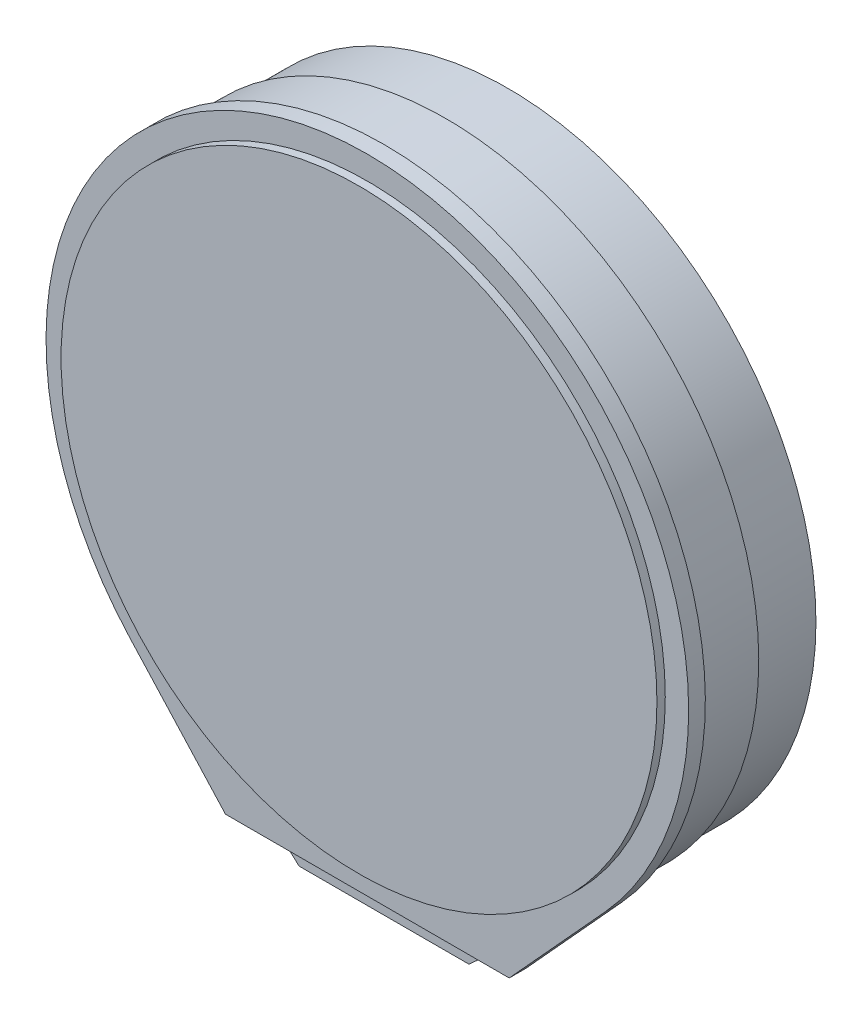
ISO-10303-21;
HEADER;
FILE_DESCRIPTION(('STEP AP214'),'2;1');
FILE_NAME('part.step','',(''),(''),'','','');
FILE_SCHEMA(('AUTOMOTIVE_DESIGN { 1 0 10303 214 1 1 1 1 }'));
ENDSEC;
DATA;
#1=APPLICATION_CONTEXT('core data for automotive mechanical design processes');
#2=APPLICATION_PROTOCOL_DEFINITION('international standard','automotive_design',2000,#1);
#3=PRODUCT_CONTEXT('',#1,'mechanical');
#4=PRODUCT('Part','Part','',(#3));
#5=PRODUCT_RELATED_PRODUCT_CATEGORY('part','',(#4));
#6=PRODUCT_DEFINITION_FORMATION('','',#4);
#7=PRODUCT_DEFINITION_CONTEXT('part definition',#1,'design');
#8=PRODUCT_DEFINITION('design','',#6,#7);
#9=PRODUCT_DEFINITION_SHAPE('','',#8);
#10=(LENGTH_UNIT() NAMED_UNIT(*) SI_UNIT(.MILLI.,.METRE.));
#11=(NAMED_UNIT(*) PLANE_ANGLE_UNIT() SI_UNIT($,.RADIAN.));
#12=(NAMED_UNIT(*) SI_UNIT($,.STERADIAN.) SOLID_ANGLE_UNIT());
#13=UNCERTAINTY_MEASURE_WITH_UNIT(LENGTH_MEASURE(1.E-05),#10,'distance_accuracy_value','');
#14=(GEOMETRIC_REPRESENTATION_CONTEXT(3) GLOBAL_UNCERTAINTY_ASSIGNED_CONTEXT((#13)) GLOBAL_UNIT_ASSIGNED_CONTEXT((#10,
#11,#12)) REPRESENTATION_CONTEXT('',''));
#15=CARTESIAN_POINT('',(0.,0.,0.));
#16=DIRECTION('',(0.,0.,1.));
#17=DIRECTION('',(1.,0.,0.));
#18=AXIS2_PLACEMENT_3D('',#15,#16,#17);
#19=CARTESIAN_POINT('',(0.,0.,0.));
#20=DIRECTION('',(0.,0.,-1.));
#21=DIRECTION('',(-1.,0.,0.));
#22=AXIS2_PLACEMENT_3D('',#19,#20,#21);
#23=PLANE('',#22);
#24=DIRECTION('',(1.,0.,0.));
#25=VECTOR('',#24,1.);
#26=CARTESIAN_POINT('',(-8.49999999999999,-19.25,0.));
#27=LINE('',#26,#25);
#28=CARTESIAN_POINT('',(-6.72235531572185,-19.25,0.));
#29=VERTEX_POINT('',#28);
#30=CARTESIAN_POINT('',(6.72235531572185,-19.25,0.));
#31=VERTEX_POINT('',#30);
#32=EDGE_CURVE('E215',#29,#31,#27,.T.);
#33=ORIENTED_EDGE('',*,*,#32,.F.);
#34=DIRECTION('',(0.7386096728915,-0.674133333333333,0.));
#35=VECTOR('',#34,1.);
#36=CARTESIAN_POINT('',(-12.64,-13.8489313667156,0.));
#37=LINE('',#36,#35);
#38=CARTESIAN_POINT('',(-5.08984679227198,-20.74,0.));
#39=VERTEX_POINT('',#38);
#40=EDGE_CURVE('E257',#29,#39,#37,.T.);
#41=ORIENTED_EDGE('',*,*,#40,.T.);
#42=DIRECTION('',(1.,0.,0.));
#43=VECTOR('',#42,1.);
#44=CARTESIAN_POINT('',(-5.08984679227198,-20.74,0.));
#45=LINE('',#44,#43);
#46=CARTESIAN_POINT('',(5.08984679227198,-20.74,0.));
#47=VERTEX_POINT('',#46);
#48=EDGE_CURVE('E262',#39,#47,#45,.T.);
#49=ORIENTED_EDGE('',*,*,#48,.T.);
#50=DIRECTION('',(0.7386096728915,0.674133333333333,0.));
#51=VECTOR('',#50,1.);
#52=CARTESIAN_POINT('',(5.08984679227198,-20.74,0.));
#53=LINE('',#52,#51);
#54=EDGE_CURVE('E248',#47,#31,#53,.T.);
#55=ORIENTED_EDGE('',*,*,#54,.T.);
#56=EDGE_LOOP('',(#33,#41,#49,#55));
#57=FACE_BOUND('',#56,.T.);
#58=ADVANCED_FACE('F39',(#57),#23,.F.);
#59=CARTESIAN_POINT('',(0.,0.,-3.7));
#60=DIRECTION('',(0.,0.,1.));
#61=DIRECTION('',(1.,0.,0.));
#62=AXIS2_PLACEMENT_3D('',#59,#60,#61);
#63=CYLINDRICAL_SURFACE('',#62,18.75);
#64=CARTESIAN_POINT('',(0.,0.,0.));
#65=DIRECTION('',(0.,0.,1.));
#66=DIRECTION('',(-1.,0.,0.));
#67=AXIS2_PLACEMENT_3D('',#64,#65,#66);
#68=CIRCLE('',#67,18.75);
#69=CARTESIAN_POINT('',(12.64,-13.8489313667156,0.));
#70=VERTEX_POINT('',#69);
#71=CARTESIAN_POINT('',(-12.64,-13.8489313667156,0.));
#72=VERTEX_POINT('',#71);
#73=EDGE_CURVE('E241',#70,#72,#68,.T.);
#74=ORIENTED_EDGE('',*,*,#73,.F.);
#75=DIRECTION('',(0.,0.,1.));
#76=VECTOR('',#75,1.);
#77=CARTESIAN_POINT('',(12.64,-13.8489313667156,-3.7));
#78=LINE('',#77,#76);
#79=CARTESIAN_POINT('',(12.64,-13.8489313667156,-3.7));
#80=VERTEX_POINT('',#79);
#81=EDGE_CURVE('E267',#80,#70,#78,.T.);
#82=ORIENTED_EDGE('',*,*,#81,.F.);
#83=CARTESIAN_POINT('',(0.,0.,-3.7));
#84=DIRECTION('',(0.,0.,1.));
#85=DIRECTION('',(-1.,0.,0.));
#86=AXIS2_PLACEMENT_3D('',#83,#84,#85);
#87=CIRCLE('',#86,18.75);
#88=CARTESIAN_POINT('',(-12.64,-13.8489313667156,-3.7));
#89=VERTEX_POINT('',#88);
#90=EDGE_CURVE('E243',#80,#89,#87,.T.);
#91=ORIENTED_EDGE('',*,*,#90,.T.);
#92=DIRECTION('',(0.,0.,1.));
#93=VECTOR('',#92,1.);
#94=CARTESIAN_POINT('',(-12.64,-13.8489313667156,-3.7));
#95=LINE('',#94,#93);
#96=EDGE_CURVE('E260',#89,#72,#95,.T.);
#97=ORIENTED_EDGE('',*,*,#96,.T.);
#98=EDGE_LOOP('',(#74,#82,#91,#97));
#99=FACE_BOUND('',#98,.T.);
#100=ADVANCED_FACE('F41',(#99),#63,.T.);
#101=CARTESIAN_POINT('',(5.08984679227198,-20.74,-3.7));
#102=DIRECTION('',(0.674133333333333,-0.7386096728915,0.));
#103=DIRECTION('',(0.7386096728915,0.674133333333333,0.));
#104=AXIS2_PLACEMENT_3D('',#101,#102,#103);
#105=PLANE('',#104);
#106=ORIENTED_EDGE('',*,*,#54,.F.);
#107=DIRECTION('',(0.,0.,1.));
#108=VECTOR('',#107,1.);
#109=CARTESIAN_POINT('',(5.08984679227198,-20.74,-3.7));
#110=LINE('',#109,#108);
#111=CARTESIAN_POINT('',(5.08984679227198,-20.74,-3.7));
#112=VERTEX_POINT('',#111);
#113=EDGE_CURVE('E271',#112,#47,#110,.T.);
#114=ORIENTED_EDGE('',*,*,#113,.F.);
#115=DIRECTION('',(0.7386096728915,0.674133333333333,0.));
#116=VECTOR('',#115,1.);
#117=CARTESIAN_POINT('',(5.08984679227198,-20.74,-3.7));
#118=LINE('',#117,#116);
#119=EDGE_CURVE('E255',#112,#80,#118,.T.);
#120=ORIENTED_EDGE('',*,*,#119,.T.);
#121=ORIENTED_EDGE('',*,*,#81,.T.);
#122=EDGE_CURVE('E270',#31,#70,#53,.T.);
#123=ORIENTED_EDGE('',*,*,#122,.F.);
#124=EDGE_LOOP('',(#106,#114,#120,#121,#123));
#125=FACE_BOUND('',#124,.T.);
#126=ADVANCED_FACE('F291',(#125),#105,.T.);
#127=CARTESIAN_POINT('',(-5.08984679227198,-20.74,-3.7));
#128=DIRECTION('',(0.,-1.,0.));
#129=DIRECTION('',(0.,0.,-1.));
#130=AXIS2_PLACEMENT_3D('',#127,#128,#129);
#131=PLANE('',#130);
#132=ORIENTED_EDGE('',*,*,#48,.F.);
#133=DIRECTION('',(0.,0.,1.));
#134=VECTOR('',#133,1.);
#135=CARTESIAN_POINT('',(-5.08984679227198,-20.74,-3.7));
#136=LINE('',#135,#134);
#137=CARTESIAN_POINT('',(-5.08984679227198,-20.74,-3.7));
#138=VERTEX_POINT('',#137);
#139=EDGE_CURVE('E272',#138,#39,#136,.T.);
#140=ORIENTED_EDGE('',*,*,#139,.F.);
#141=DIRECTION('',(1.,0.,0.));
#142=VECTOR('',#141,1.);
#143=CARTESIAN_POINT('',(-5.08984679227198,-20.74,-3.7));
#144=LINE('',#143,#142);
#145=CARTESIAN_POINT('',(-2.9,-20.74,-3.7));
#146=VERTEX_POINT('',#145);
#147=EDGE_CURVE('E252',#138,#146,#144,.T.);
#148=ORIENTED_EDGE('',*,*,#147,.T.);
#149=CARTESIAN_POINT('',(2.9,-20.74,-3.7));
#150=VERTEX_POINT('',#149);
#151=EDGE_CURVE('E177',#146,#150,#144,.T.);
#152=ORIENTED_EDGE('',*,*,#151,.T.);
#153=EDGE_CURVE('E53',#150,#112,#144,.T.);
#154=ORIENTED_EDGE('',*,*,#153,.T.);
#155=ORIENTED_EDGE('',*,*,#113,.T.);
#156=EDGE_LOOP('',(#132,#140,#148,#152,#154,#155));
#157=FACE_BOUND('',#156,.T.);
#158=ADVANCED_FACE('F300',(#157),#131,.T.);
#159=CARTESIAN_POINT('',(-12.64,-13.8489313667156,-3.7));
#160=DIRECTION('',(-0.674133333333333,-0.7386096728915,0.));
#161=DIRECTION('',(0.7386096728915,-0.674133333333333,0.));
#162=AXIS2_PLACEMENT_3D('',#159,#160,#161);
#163=PLANE('',#162);
#164=EDGE_CURVE('E261',#72,#29,#37,.T.);
#165=ORIENTED_EDGE('',*,*,#164,.F.);
#166=ORIENTED_EDGE('',*,*,#96,.F.);
#167=DIRECTION('',(0.7386096728915,-0.674133333333333,0.));
#168=VECTOR('',#167,1.);
#169=CARTESIAN_POINT('',(-12.64,-13.8489313667156,-3.7));
#170=LINE('',#169,#168);
#171=EDGE_CURVE('E247',#89,#138,#170,.T.);
#172=ORIENTED_EDGE('',*,*,#171,.T.);
#173=ORIENTED_EDGE('',*,*,#139,.T.);
#174=ORIENTED_EDGE('',*,*,#40,.F.);
#175=EDGE_LOOP('',(#165,#166,#172,#173,#174));
#176=FACE_BOUND('',#175,.T.);
#177=ADVANCED_FACE('F285',(#176),#163,.T.);
#178=CARTESIAN_POINT('',(0.,0.,-3.7));
#179=DIRECTION('',(0.,0.,-1.));
#180=DIRECTION('',(-1.,0.,0.));
#181=AXIS2_PLACEMENT_3D('',#178,#179,#180);
#182=PLANE('',#181);
#183=DIRECTION('',(0.,-1.,0.));
#184=VECTOR('',#183,1.);
#185=CARTESIAN_POINT('',(2.9,19.252,-3.7));
#186=LINE('',#185,#184);
#187=CARTESIAN_POINT('',(2.9,-18.2476169879188,-3.7));
#188=VERTEX_POINT('',#187);
#189=EDGE_CURVE('E175',#188,#150,#186,.T.);
#190=ORIENTED_EDGE('',*,*,#189,.F.);
#191=CARTESIAN_POINT('',(0.,0.,-3.7));
#192=DIRECTION('',(0.,0.,-1.));
#193=DIRECTION('',(-1.,0.,0.));
#194=AXIS2_PLACEMENT_3D('',#191,#192,#193);
#195=CIRCLE('',#194,18.4766210584561);
#196=CARTESIAN_POINT('',(-2.9,-18.2476169879188,-3.7));
#197=VERTEX_POINT('',#196);
#198=EDGE_CURVE('E11',#197,#188,#195,.T.);
#199=ORIENTED_EDGE('',*,*,#198,.F.);
#200=DIRECTION('',(0.,-1.,0.));
#201=VECTOR('',#200,1.);
#202=CARTESIAN_POINT('',(-2.9,19.252,-3.7));
#203=LINE('',#202,#201);
#204=EDGE_CURVE('E62',#197,#146,#203,.T.);
#205=ORIENTED_EDGE('',*,*,#204,.T.);
#206=ORIENTED_EDGE('',*,*,#147,.F.);
#207=ORIENTED_EDGE('',*,*,#171,.F.);
#208=ORIENTED_EDGE('',*,*,#90,.F.);
#209=ORIENTED_EDGE('',*,*,#119,.F.);
#210=ORIENTED_EDGE('',*,*,#153,.F.);
#211=EDGE_LOOP('',(#190,#199,#205,#206,#207,#208,#209,#210));
#212=FACE_BOUND('',#211,.T.);
#213=ADVANCED_FACE('F293',(#212),#182,.T.);
#214=CARTESIAN_POINT('',(0.,0.,0.));
#215=DIRECTION('',(0.,0.,1.));
#216=DIRECTION('',(1.,0.,0.));
#217=AXIS2_PLACEMENT_3D('',#214,#215,#216);
#218=PLANE('',#217);
#219=ORIENTED_EDGE('',*,*,#73,.T.);
#220=ORIENTED_EDGE('',*,*,#164,.T.);
#221=CARTESIAN_POINT('',(-8.49999999999999,-19.25,0.));
#222=VERTEX_POINT('',#221);
#223=EDGE_CURVE('E226',#222,#29,#27,.T.);
#224=ORIENTED_EDGE('',*,*,#223,.F.);
#225=DIRECTION('',(0.673676781933663,-0.739026111503175,0.));
#226=VECTOR('',#225,1.);
#227=CARTESIAN_POINT('',(-14.2262526464361,-12.968278052223,0.));
#228=LINE('',#227,#226);
#229=CARTESIAN_POINT('',(-14.2262526464361,-12.968278052223,0.));
#230=VERTEX_POINT('',#229);
#231=EDGE_CURVE('E227',#230,#222,#228,.T.);
#232=ORIENTED_EDGE('',*,*,#231,.F.);
#233=CARTESIAN_POINT('',(0.,0.,0.));
#234=DIRECTION('',(0.,0.,1.));
#235=DIRECTION('',(1.,0.,0.));
#236=AXIS2_PLACEMENT_3D('',#233,#234,#235);
#237=CIRCLE('',#236,19.25);
#238=CARTESIAN_POINT('',(14.2262526464361,-12.968278052223,0.));
#239=VERTEX_POINT('',#238);
#240=EDGE_CURVE('E207',#239,#230,#237,.T.);
#241=ORIENTED_EDGE('',*,*,#240,.F.);
#242=DIRECTION('',(0.673676781933663,0.739026111503175,0.));
#243=VECTOR('',#242,1.);
#244=CARTESIAN_POINT('',(8.50000000000001,-19.25,0.));
#245=LINE('',#244,#243);
#246=CARTESIAN_POINT('',(8.50000000000001,-19.25,0.));
#247=VERTEX_POINT('',#246);
#248=EDGE_CURVE('E220',#247,#239,#245,.T.);
#249=ORIENTED_EDGE('',*,*,#248,.F.);
#250=EDGE_CURVE('E230',#31,#247,#27,.T.);
#251=ORIENTED_EDGE('',*,*,#250,.F.);
#252=ORIENTED_EDGE('',*,*,#122,.T.);
#253=EDGE_LOOP('',(#219,#220,#224,#232,#241,#249,#251,#252));
#254=FACE_BOUND('',#253,.T.);
#255=ADVANCED_FACE('F286',(#254),#218,.F.);
#256=CARTESIAN_POINT('',(0.,0.,1.));
#257=DIRECTION('',(0.,0.,-1.));
#258=DIRECTION('',(-1.,0.,0.));
#259=AXIS2_PLACEMENT_3D('',#256,#257,#258);
#260=CYLINDRICAL_SURFACE('',#259,19.25);
#261=ORIENTED_EDGE('',*,*,#240,.T.);
#262=DIRECTION('',(0.,0.,-1.));
#263=VECTOR('',#262,1.);
#264=CARTESIAN_POINT('',(-14.2262526464361,-12.968278052223,1.));
#265=LINE('',#264,#263);
#266=CARTESIAN_POINT('',(-14.2262526464361,-12.968278052223,1.));
#267=VERTEX_POINT('',#266);
#268=EDGE_CURVE('E242',#267,#230,#265,.T.);
#269=ORIENTED_EDGE('',*,*,#268,.F.);
#270=CARTESIAN_POINT('',(0.,0.,1.));
#271=DIRECTION('',(0.,0.,1.));
#272=DIRECTION('',(1.,0.,0.));
#273=AXIS2_PLACEMENT_3D('',#270,#271,#272);
#274=CIRCLE('',#273,19.25);
#275=CARTESIAN_POINT('',(14.2262526464361,-12.968278052223,1.));
#276=VERTEX_POINT('',#275);
#277=EDGE_CURVE('E213',#276,#267,#274,.T.);
#278=ORIENTED_EDGE('',*,*,#277,.F.);
#279=DIRECTION('',(0.,0.,-1.));
#280=VECTOR('',#279,1.);
#281=CARTESIAN_POINT('',(14.2262526464361,-12.968278052223,1.));
#282=LINE('',#281,#280);
#283=EDGE_CURVE('E224',#276,#239,#282,.T.);
#284=ORIENTED_EDGE('',*,*,#283,.T.);
#285=EDGE_LOOP('',(#261,#269,#278,#284));
#286=FACE_BOUND('',#285,.T.);
#287=ADVANCED_FACE('F313',(#286),#260,.T.);
#288=CARTESIAN_POINT('',(-14.2262526464361,-12.968278052223,1.));
#289=DIRECTION('',(0.739026111503176,0.673676781933663,0.));
#290=DIRECTION('',(-0.673676781933663,0.739026111503176,0.));
#291=AXIS2_PLACEMENT_3D('',#288,#289,#290);
#292=PLANE('',#291);
#293=ORIENTED_EDGE('',*,*,#231,.T.);
#294=DIRECTION('',(0.,0.,-1.));
#295=VECTOR('',#294,1.);
#296=CARTESIAN_POINT('',(-8.49999999999999,-19.25,1.));
#297=LINE('',#296,#295);
#298=CARTESIAN_POINT('',(-8.49999999999999,-19.25,1.));
#299=VERTEX_POINT('',#298);
#300=EDGE_CURVE('E236',#299,#222,#297,.T.);
#301=ORIENTED_EDGE('',*,*,#300,.F.);
#302=DIRECTION('',(0.673676781933663,-0.739026111503175,0.));
#303=VECTOR('',#302,1.);
#304=CARTESIAN_POINT('',(-14.2262526464361,-12.968278052223,1.));
#305=LINE('',#304,#303);
#306=EDGE_CURVE('E216',#267,#299,#305,.T.);
#307=ORIENTED_EDGE('',*,*,#306,.F.);
#308=ORIENTED_EDGE('',*,*,#268,.T.);
#309=EDGE_LOOP('',(#293,#301,#307,#308));
#310=FACE_BOUND('',#309,.T.);
#311=ADVANCED_FACE('F320',(#310),#292,.F.);
#312=CARTESIAN_POINT('',(-8.49999999999999,-19.25,1.));
#313=DIRECTION('',(0.,1.,0.));
#314=DIRECTION('',(-1.,0.,0.));
#315=AXIS2_PLACEMENT_3D('',#312,#313,#314);
#316=PLANE('',#315);
#317=ORIENTED_EDGE('',*,*,#223,.T.);
#318=ORIENTED_EDGE('',*,*,#32,.T.);
#319=ORIENTED_EDGE('',*,*,#250,.T.);
#320=DIRECTION('',(0.,0.,-1.));
#321=VECTOR('',#320,1.);
#322=CARTESIAN_POINT('',(8.50000000000001,-19.25,1.));
#323=LINE('',#322,#321);
#324=CARTESIAN_POINT('',(8.50000000000001,-19.25,1.));
#325=VERTEX_POINT('',#324);
#326=EDGE_CURVE('E234',#325,#247,#323,.T.);
#327=ORIENTED_EDGE('',*,*,#326,.F.);
#328=DIRECTION('',(1.,0.,0.));
#329=VECTOR('',#328,1.);
#330=CARTESIAN_POINT('',(-8.49999999999999,-19.25,1.));
#331=LINE('',#330,#329);
#332=EDGE_CURVE('E218',#299,#325,#331,.T.);
#333=ORIENTED_EDGE('',*,*,#332,.F.);
#334=ORIENTED_EDGE('',*,*,#300,.T.);
#335=EDGE_LOOP('',(#317,#318,#319,#327,#333,#334));
#336=FACE_BOUND('',#335,.T.);
#337=ADVANCED_FACE('F305',(#336),#316,.F.);
#338=CARTESIAN_POINT('',(8.50000000000001,-19.25,1.));
#339=DIRECTION('',(-0.739026111503176,0.673676781933663,0.));
#340=DIRECTION('',(-0.673676781933663,-0.739026111503176,0.));
#341=AXIS2_PLACEMENT_3D('',#338,#339,#340);
#342=PLANE('',#341);
#343=ORIENTED_EDGE('',*,*,#248,.T.);
#344=ORIENTED_EDGE('',*,*,#283,.F.);
#345=DIRECTION('',(0.673676781933663,0.739026111503175,0.));
#346=VECTOR('',#345,1.);
#347=CARTESIAN_POINT('',(8.50000000000001,-19.25,1.));
#348=LINE('',#347,#346);
#349=EDGE_CURVE('E222',#325,#276,#348,.T.);
#350=ORIENTED_EDGE('',*,*,#349,.F.);
#351=ORIENTED_EDGE('',*,*,#326,.T.);
#352=EDGE_LOOP('',(#343,#344,#350,#351));
#353=FACE_BOUND('',#352,.T.);
#354=ADVANCED_FACE('F308',(#353),#342,.F.);
#355=CARTESIAN_POINT('',(0.,0.,1.));
#356=DIRECTION('',(0.,0.,1.));
#357=DIRECTION('',(1.,0.,0.));
#358=AXIS2_PLACEMENT_3D('',#355,#356,#357);
#359=PLANE('',#358);
#360=CARTESIAN_POINT('',(0.,0.,1.));
#361=DIRECTION('',(0.,0.,1.));
#362=DIRECTION('',(1.,0.,0.));
#363=AXIS2_PLACEMENT_3D('',#360,#361,#362);
#364=CIRCLE('',#363,17.85);
#365=CARTESIAN_POINT('',(17.85,0.,1.));
#366=VERTEX_POINT('',#365);
#367=EDGE_CURVE('E50',#366,#366,#364,.T.);
#368=ORIENTED_EDGE('',*,*,#367,.F.);
#369=EDGE_LOOP('',(#368));
#370=FACE_BOUND('',#369,.T.);
#371=ORIENTED_EDGE('',*,*,#277,.T.);
#372=ORIENTED_EDGE('',*,*,#306,.T.);
#373=ORIENTED_EDGE('',*,*,#332,.T.);
#374=ORIENTED_EDGE('',*,*,#349,.T.);
#375=EDGE_LOOP('',(#371,#372,#373,#374));
#376=FACE_BOUND('',#375,.T.);
#377=ADVANCED_FACE('F314',(#370,#376),#359,.T.);
#378=CARTESIAN_POINT('',(0.,0.,1.5));
#379=DIRECTION('',(0.,0.,-1.));
#380=DIRECTION('',(-1.,0.,0.));
#381=AXIS2_PLACEMENT_3D('',#378,#379,#380);
#382=CYLINDRICAL_SURFACE('',#381,17.85);
#383=CARTESIAN_POINT('',(0.,0.,1.5));
#384=DIRECTION('',(0.,0.,1.));
#385=DIRECTION('',(1.,0.,0.));
#386=AXIS2_PLACEMENT_3D('',#383,#384,#385);
#387=CIRCLE('',#386,17.85);
#388=CARTESIAN_POINT('',(17.85,0.,1.5));
#389=VERTEX_POINT('',#388);
#390=EDGE_CURVE('E206',#389,#389,#387,.T.);
#391=ORIENTED_EDGE('',*,*,#390,.F.);
#392=EDGE_LOOP('',(#391));
#393=FACE_BOUND('',#392,.T.);
#394=ORIENTED_EDGE('',*,*,#367,.T.);
#395=EDGE_LOOP('',(#394));
#396=FACE_BOUND('',#395,.T.);
#397=ADVANCED_FACE('F351',(#393,#396),#382,.T.);
#398=CARTESIAN_POINT('',(0.,0.,1.5));
#399=DIRECTION('',(0.,0.,1.));
#400=DIRECTION('',(1.,0.,0.));
#401=AXIS2_PLACEMENT_3D('',#398,#399,#400);
#402=PLANE('',#401);
#403=ORIENTED_EDGE('',*,*,#390,.T.);
#404=EDGE_LOOP('',(#403));
#405=FACE_BOUND('',#404,.T.);
#406=ADVANCED_FACE('F358',(#405),#402,.T.);
#407=CARTESIAN_POINT('',(0.,0.,-7.4));
#408=DIRECTION('',(0.,0.,1.));
#409=DIRECTION('',(1.,0.,0.));
#410=AXIS2_PLACEMENT_3D('',#407,#408,#409);
#411=CYLINDRICAL_SURFACE('',#410,18.4766210584561);
#412=CARTESIAN_POINT('',(2.9,-18.2476169879188,-3.7));
#413=CARTESIAN_POINT('',(2.94574135987661,-18.2403485397385,-3.70000050805307));
#414=CARTESIAN_POINT('',(2.99143210800008,-18.23290959918,-3.70196262020682));
#415=CARTESIAN_POINT('',(3.08242755504852,-18.2177465231141,-3.70977752768522));
#416=CARTESIAN_POINT('',(3.12773229049619,-18.2100224149651,-3.71562995069222));
#417=CARTESIAN_POINT('',(3.26251042489939,-18.1865288004241,-3.73894972430463));
#418=CARTESIAN_POINT('',(3.35099501160416,-18.17041453534,-3.76217980630119));
#419=CARTESIAN_POINT('',(3.52265925656955,-18.1379175657642,-3.82331086073215));
#420=CARTESIAN_POINT('',(3.60583766110316,-18.1215347989728,-3.86121528552661));
#421=CARTESIAN_POINT('',(3.76461493936751,-18.0892168010979,-3.9506529688397));
#422=CARTESIAN_POINT('',(3.84021457880043,-18.0732815249207,-4.00218484862375));
#423=CARTESIAN_POINT('',(3.98183069828908,-18.0426112468145,-4.11762706665945));
#424=CARTESIAN_POINT('',(4.04782781052399,-18.0278786962747,-4.18156183144911));
#425=CARTESIAN_POINT('',(4.16810245302212,-18.0004517237891,-4.32003854943417));
#426=CARTESIAN_POINT('',(4.22237950910234,-17.9877573843128,-4.39458093160192));
#427=CARTESIAN_POINT('',(4.31673115945308,-17.9653466850374,-4.55094789870452));
#428=CARTESIAN_POINT('',(4.35701640463492,-17.9555864830872,-4.63263896906447));
#429=CARTESIAN_POINT('',(4.4232219092382,-17.9393925267998,-4.80195140575219));
#430=CARTESIAN_POINT('',(4.44914552981681,-17.9329579941553,-4.88957137910371));
#431=CARTESIAN_POINT('',(4.4852364234967,-17.9239649381523,-5.06571492816385));
#432=CARTESIAN_POINT('',(4.49581033859622,-17.9213064240852,-5.15415018495788));
#433=CARTESIAN_POINT('',(4.50214876997347,-17.919715252995,-5.33158022021443));
#434=CARTESIAN_POINT('',(4.49791468996887,-17.9207822428142,-5.42057494484412));
#435=CARTESIAN_POINT('',(4.47497309031092,-17.9265243230581,-5.59509930712475));
#436=CARTESIAN_POINT('',(4.45649809855941,-17.9311414433984,-5.68066159797324));
#437=CARTESIAN_POINT('',(4.40596242011739,-17.9436254062684,-5.84742006417323));
#438=CARTESIAN_POINT('',(4.37390130061601,-17.951492352327,-5.92861610033685));
#439=CARTESIAN_POINT('',(4.29684339945518,-17.9700929312506,-6.08518215392118));
#440=CARTESIAN_POINT('',(4.25173166339273,-17.9808519763212,-6.16049249289004));
#441=CARTESIAN_POINT('',(4.15003563256678,-18.0045952108901,-6.3025176890538));
#442=CARTESIAN_POINT('',(4.09345043975032,-18.0175795745567,-6.36923187273961));
#443=CARTESIAN_POINT('',(3.96880501100291,-18.0454505555273,-6.49399706529904));
#444=CARTESIAN_POINT('',(3.90048829492797,-18.0603773326282,-6.55178285282338));
#445=CARTESIAN_POINT('',(3.75530349888284,-18.0911227047694,-6.65513809327409));
#446=CARTESIAN_POINT('',(3.67843158592713,-18.106941697971,-6.70070203901833));
#447=CARTESIAN_POINT('',(3.51645221080785,-18.1391029594718,-6.77928116973917));
#448=CARTESIAN_POINT('',(3.43120005728316,-18.1554490575632,-6.81199607803207));
#449=CARTESIAN_POINT('',(3.25635916708185,-18.1876198094878,-6.86245325251838));
#450=CARTESIAN_POINT('',(3.16677727281928,-18.2034452236736,-6.88021837574637));
#451=CARTESIAN_POINT('',(3.0470799568547,-18.22365834574,-6.89349943453923));
#452=CARTESIAN_POINT('',(3.01770646561756,-18.2285453832847,-6.89593745706605));
#453=CARTESIAN_POINT('',(2.958896450911,-18.2381835698962,-6.89918561101981));
#454=CARTESIAN_POINT('',(2.92946010695464,-18.2429349265141,-6.8999983764364));
#455=CARTESIAN_POINT('',(2.9,-18.2476169879188,-6.9));
#456=B_SPLINE_CURVE_WITH_KNOTS('',3,(#412,#413,#414,#415,#416,#417,#418,#419,#420,#421,#422,
#423,#424,#425,#426,#427,#428,#429,#430,#431,#432,#433,#434,#435,#436,#437,#438,#439,#440,#441,
#442,#443,#444,#445,#446,#447,#448,#449,#450,#451,#452,#453,#454,#455),.UNSPECIFIED.,.F.,.F.,(4,
2,2,2,2,2,2,2,2,2,2,2,2,2,2,2,2,2,2,2,2,4),(0.,0.138858371493959,0.277703455622433,
0.554951988025821,0.832265786997579,1.10955153994458,1.38738903407231,1.66523776715145,
1.93870090134817,2.21210000787957,2.47811507353407,2.74410492308587,3.00584132125186,
3.26758605813512,3.53171044420565,3.79585551186443,4.06675661894749,4.33777959023551,
4.61480510517371,4.8914062965676,4.98100493822506,5.07045825285307),.UNSPECIFIED.);
#457=CARTESIAN_POINT('',(2.9,-18.2476169879188,-6.9));
#458=VERTEX_POINT('',#457);
#459=EDGE_CURVE('E166',#188,#458,#456,.T.);
#460=ORIENTED_EDGE('',*,*,#459,.T.);
#461=CARTESIAN_POINT('',(0.,0.,-6.9));
#462=DIRECTION('',(0.,0.,-1.));
#463=DIRECTION('',(-1.,0.,0.));
#464=AXIS2_PLACEMENT_3D('',#461,#462,#463);
#465=CIRCLE('',#464,18.4766210584561);
#466=CARTESIAN_POINT('',(-2.9,-18.2476169879188,-6.9));
#467=VERTEX_POINT('',#466);
#468=EDGE_CURVE('E187',#458,#467,#465,.T.);
#469=ORIENTED_EDGE('',*,*,#468,.T.);
#470=CARTESIAN_POINT('',(-2.9,-18.2476169879188,-6.9));
#471=CARTESIAN_POINT('',(-2.94574135987661,-18.2403485397385,-6.89999949194693));
#472=CARTESIAN_POINT('',(-2.99143210800008,-18.23290959918,-6.89803737979318));
#473=CARTESIAN_POINT('',(-3.08242755504851,-18.2177465231141,-6.89022247231478));
#474=CARTESIAN_POINT('',(-3.12773229049619,-18.2100224149651,-6.88437004930778));
#475=CARTESIAN_POINT('',(-3.26251042489939,-18.1865288004241,-6.86105027569537));
#476=CARTESIAN_POINT('',(-3.35099501160416,-18.17041453534,-6.83782019369881));
#477=CARTESIAN_POINT('',(-3.52265925656955,-18.1379175657642,-6.77668913926785));
#478=CARTESIAN_POINT('',(-3.60583766110316,-18.1215347989728,-6.73878471447339));
#479=CARTESIAN_POINT('',(-3.76461493936751,-18.0892168010979,-6.6493470311603));
#480=CARTESIAN_POINT('',(-3.84021457880043,-18.0732815249207,-6.59781515137625));
#481=CARTESIAN_POINT('',(-3.98183069828908,-18.0426112468145,-6.48237293334055));
#482=CARTESIAN_POINT('',(-4.04782781052399,-18.0278786962747,-6.41843816855089));
#483=CARTESIAN_POINT('',(-4.16810245302212,-18.0004517237891,-6.27996145056584));
#484=CARTESIAN_POINT('',(-4.22237950910234,-17.9877573843128,-6.20541906839808));
#485=CARTESIAN_POINT('',(-4.31673115945308,-17.9653466850374,-6.04905210129548));
#486=CARTESIAN_POINT('',(-4.35701640463492,-17.9555864830872,-5.96736103093553));
#487=CARTESIAN_POINT('',(-4.4232219092382,-17.9393925267998,-5.79804859424781));
#488=CARTESIAN_POINT('',(-4.44914552981681,-17.9329579941553,-5.71042862089629));
#489=CARTESIAN_POINT('',(-4.4852364234967,-17.9239649381523,-5.53428507183615));
#490=CARTESIAN_POINT('',(-4.49581033859622,-17.9213064240852,-5.44584981504212));
#491=CARTESIAN_POINT('',(-4.50214876997347,-17.919715252995,-5.26841977978557));
#492=CARTESIAN_POINT('',(-4.49791468996887,-17.9207822428142,-5.17942505515588));
#493=CARTESIAN_POINT('',(-4.47497309031092,-17.9265243230581,-5.00490069287525));
#494=CARTESIAN_POINT('',(-4.45649809855941,-17.9311414433984,-4.91933840202676));
#495=CARTESIAN_POINT('',(-4.40596242011739,-17.9436254062684,-4.75257993582677));
#496=CARTESIAN_POINT('',(-4.37390130061601,-17.951492352327,-4.67138389966315));
#497=CARTESIAN_POINT('',(-4.29684339945518,-17.9700929312506,-4.51481784607882));
#498=CARTESIAN_POINT('',(-4.25173166339273,-17.9808519763212,-4.43950750710996));
#499=CARTESIAN_POINT('',(-4.15003563256678,-18.0045952108901,-4.2974823109462));
#500=CARTESIAN_POINT('',(-4.09345043975032,-18.0175795745567,-4.23076812726039));
#501=CARTESIAN_POINT('',(-3.96880501100291,-18.0454505555273,-4.10600293470096));
#502=CARTESIAN_POINT('',(-3.90048829492797,-18.0603773326282,-4.04821714717662));
#503=CARTESIAN_POINT('',(-3.75530349888284,-18.0911227047694,-3.94486190672591));
#504=CARTESIAN_POINT('',(-3.67843158592713,-18.106941697971,-3.89929796098167));
#505=CARTESIAN_POINT('',(-3.51645221080785,-18.1391029594718,-3.82071883026083));
#506=CARTESIAN_POINT('',(-3.43120005728316,-18.1554490575632,-3.78800392196793));
#507=CARTESIAN_POINT('',(-3.25635916708185,-18.1876198094878,-3.73754674748162));
#508=CARTESIAN_POINT('',(-3.16677727281928,-18.2034452236736,-3.71978162425363));
#509=CARTESIAN_POINT('',(-3.0470799568547,-18.22365834574,-3.70650056546077));
#510=CARTESIAN_POINT('',(-3.01770646561756,-18.2285453832847,-3.70406254293395));
#511=CARTESIAN_POINT('',(-2.958896450911,-18.2381835698962,-3.70081438898019));
#512=CARTESIAN_POINT('',(-2.92946010695464,-18.2429349265141,-3.70000162356361));
#513=CARTESIAN_POINT('',(-2.9,-18.2476169879188,-3.7));
#514=B_SPLINE_CURVE_WITH_KNOTS('',3,(#470,#471,#472,#473,#474,#475,#476,#477,#478,#479,#480,
#481,#482,#483,#484,#485,#486,#487,#488,#489,#490,#491,#492,#493,#494,#495,#496,#497,#498,#499,
#500,#501,#502,#503,#504,#505,#506,#507,#508,#509,#510,#511,#512,#513),.UNSPECIFIED.,.F.,.F.,(4,
2,2,2,2,2,2,2,2,2,2,2,2,2,2,2,2,2,2,2,2,4),(0.,0.138858371493958,0.277703455622433,
0.55495198802582,0.832265786997579,1.10955153994458,1.38738903407231,1.66523776715145,
1.93870090134817,2.21210000787957,2.47811507353407,2.74410492308587,3.00584132125186,
3.26758605813512,3.53171044420565,3.79585551186443,4.06675661894749,4.33777959023551,
4.61480510517371,4.8914062965676,4.98100493822506,5.07045825285307),.UNSPECIFIED.);
#515=EDGE_CURVE('E146',#467,#197,#514,.T.);
#516=ORIENTED_EDGE('',*,*,#515,.T.);
#517=ORIENTED_EDGE('',*,*,#198,.T.);
#518=EDGE_LOOP('',(#460,#469,#516,#517));
#519=FACE_BOUND('',#518,.T.);
#520=CARTESIAN_POINT('',(0.,0.,-7.4));
#521=DIRECTION('',(0.,0.,1.));
#522=DIRECTION('',(1.,0.,0.));
#523=AXIS2_PLACEMENT_3D('',#520,#521,#522);
#524=CIRCLE('',#523,18.4766210584561);
#525=CARTESIAN_POINT('',(18.4766210584561,0.,-7.4));
#526=VERTEX_POINT('',#525);
#527=EDGE_CURVE('E201',#526,#526,#524,.T.);
#528=ORIENTED_EDGE('',*,*,#527,.T.);
#529=EDGE_LOOP('',(#528));
#530=FACE_BOUND('',#529,.T.);
#531=ADVANCED_FACE('F368',(#519,#530),#411,.T.);
#532=CARTESIAN_POINT('',(0.,0.,-7.4));
#533=DIRECTION('',(0.,0.,1.));
#534=DIRECTION('',(1.,0.,0.));
#535=AXIS2_PLACEMENT_3D('',#532,#533,#534);
#536=PLANE('',#535);
#537=ORIENTED_EDGE('',*,*,#527,.F.);
#538=EDGE_LOOP('',(#537));
#539=FACE_BOUND('',#538,.T.);
#540=ADVANCED_FACE('F371',(#539),#536,.F.);
#541=CARTESIAN_POINT('',(-2.9,19.252,-3.7));
#542=DIRECTION('',(0.,0.,1.));
#543=DIRECTION('',(1.,0.,0.));
#544=AXIS2_PLACEMENT_3D('',#541,#542,#543);
#545=PLANE('',#544);
#546=ORIENTED_EDGE('',*,*,#151,.F.);
#547=CARTESIAN_POINT('',(-2.9,-21.59,-3.7));
#548=VERTEX_POINT('',#547);
#549=EDGE_CURVE('E176',#146,#548,#203,.T.);
#550=ORIENTED_EDGE('',*,*,#549,.T.);
#551=DIRECTION('',(-1.,0.,0.));
#552=VECTOR('',#551,1.);
#553=CARTESIAN_POINT('',(-2.9,-21.59,-3.7));
#554=LINE('',#553,#552);
#555=CARTESIAN_POINT('',(2.9,-21.59,-3.7));
#556=VERTEX_POINT('',#555);
#557=EDGE_CURVE('E164',#556,#548,#554,.T.);
#558=ORIENTED_EDGE('',*,*,#557,.F.);
#559=EDGE_CURVE('E174',#150,#556,#186,.T.);
#560=ORIENTED_EDGE('',*,*,#559,.F.);
#561=EDGE_LOOP('',(#546,#550,#558,#560));
#562=FACE_BOUND('',#561,.T.);
#563=ADVANCED_FACE('F192',(#562),#545,.T.);
#564=CARTESIAN_POINT('',(2.9,19.252,-5.3));
#565=DIRECTION('',(0.,-1.,0.));
#566=DIRECTION('',(0.,0.,-1.));
#567=AXIS2_PLACEMENT_3D('',#564,#565,#566);
#568=CYLINDRICAL_SURFACE('',#567,1.6);
#569=ORIENTED_EDGE('',*,*,#459,.F.);
#570=ORIENTED_EDGE('',*,*,#189,.T.);
#571=ORIENTED_EDGE('',*,*,#559,.T.);
#572=CARTESIAN_POINT('',(2.9,-21.59,-5.3));
#573=DIRECTION('',(0.,-1.,0.));
#574=DIRECTION('',(0.,0.,-1.));
#575=AXIS2_PLACEMENT_3D('',#572,#573,#574);
#576=CIRCLE('',#575,1.6);
#577=CARTESIAN_POINT('',(2.9,-21.59,-6.9));
#578=VERTEX_POINT('',#577);
#579=EDGE_CURVE('E159',#578,#556,#576,.T.);
#580=ORIENTED_EDGE('',*,*,#579,.F.);
#581=DIRECTION('',(0.,-1.,0.));
#582=VECTOR('',#581,1.);
#583=CARTESIAN_POINT('',(2.9,19.252,-6.9));
#584=LINE('',#583,#582);
#585=EDGE_CURVE('E151',#458,#578,#584,.T.);
#586=ORIENTED_EDGE('',*,*,#585,.F.);
#587=EDGE_LOOP('',(#569,#570,#571,#580,#586));
#588=FACE_BOUND('',#587,.T.);
#589=ADVANCED_FACE('F194',(#588),#568,.T.);
#590=CARTESIAN_POINT('',(-2.9,19.252,-6.9));
#591=DIRECTION('',(0.,0.,-1.));
#592=DIRECTION('',(-1.,0.,0.));
#593=AXIS2_PLACEMENT_3D('',#590,#591,#592);
#594=PLANE('',#593);
#595=ORIENTED_EDGE('',*,*,#468,.F.);
#596=ORIENTED_EDGE('',*,*,#585,.T.);
#597=DIRECTION('',(1.,0.,0.));
#598=VECTOR('',#597,1.);
#599=CARTESIAN_POINT('',(-2.9,-21.59,-6.9));
#600=LINE('',#599,#598);
#601=CARTESIAN_POINT('',(-2.9,-21.59,-6.9));
#602=VERTEX_POINT('',#601);
#603=EDGE_CURVE('E152',#602,#578,#600,.T.);
#604=ORIENTED_EDGE('',*,*,#603,.F.);
#605=DIRECTION('',(0.,-1.,0.));
#606=VECTOR('',#605,1.);
#607=CARTESIAN_POINT('',(-2.9,19.252,-6.9));
#608=LINE('',#607,#606);
#609=EDGE_CURVE('E142',#467,#602,#608,.T.);
#610=ORIENTED_EDGE('',*,*,#609,.F.);
#611=EDGE_LOOP('',(#595,#596,#604,#610));
#612=FACE_BOUND('',#611,.T.);
#613=ADVANCED_FACE('F154',(#612),#594,.T.);
#614=CARTESIAN_POINT('',(-2.9,19.252,-5.3));
#615=DIRECTION('',(0.,-1.,0.));
#616=DIRECTION('',(0.,0.,-1.));
#617=AXIS2_PLACEMENT_3D('',#614,#615,#616);
#618=CYLINDRICAL_SURFACE('',#617,1.6);
#619=ORIENTED_EDGE('',*,*,#515,.F.);
#620=ORIENTED_EDGE('',*,*,#609,.T.);
#621=CARTESIAN_POINT('',(-2.9,-21.59,-5.3));
#622=DIRECTION('',(0.,-1.,0.));
#623=DIRECTION('',(0.,0.,-1.));
#624=AXIS2_PLACEMENT_3D('',#621,#622,#623);
#625=CIRCLE('',#624,1.6);
#626=EDGE_CURVE('E150',#548,#602,#625,.T.);
#627=ORIENTED_EDGE('',*,*,#626,.F.);
#628=ORIENTED_EDGE('',*,*,#549,.F.);
#629=ORIENTED_EDGE('',*,*,#204,.F.);
#630=EDGE_LOOP('',(#619,#620,#627,#628,#629));
#631=FACE_BOUND('',#630,.T.);
#632=ADVANCED_FACE('F145',(#631),#618,.T.);
#633=CARTESIAN_POINT('',(-2.9,-21.59,-5.3));
#634=DIRECTION('',(0.,-1.,0.));
#635=DIRECTION('',(0.,0.,-1.));
#636=AXIS2_PLACEMENT_3D('',#633,#634,#635);
#637=PLANE('',#636);
#638=ORIENTED_EDGE('',*,*,#626,.T.);
#639=ORIENTED_EDGE('',*,*,#603,.T.);
#640=ORIENTED_EDGE('',*,*,#579,.T.);
#641=ORIENTED_EDGE('',*,*,#557,.T.);
#642=EDGE_LOOP('',(#638,#639,#640,#641));
#643=FACE_BOUND('',#642,.T.);
#644=ADVANCED_FACE('F162',(#643),#637,.T.);
#645=CLOSED_SHELL('',(#58,#100,#126,#158,#177,#213,#255,#287,#311,#337,#354,#377,#397,#406,#531,
#540,#563,#589,#613,#632,#644));
#646=MANIFOLD_SOLID_BREP('B2',#645);
#647=ADVANCED_BREP_SHAPE_REPRESENTATION('',(#18,#646),#14);
#648=SHAPE_DEFINITION_REPRESENTATION(#9,#647);
ENDSEC;
END-ISO-10303-21;
